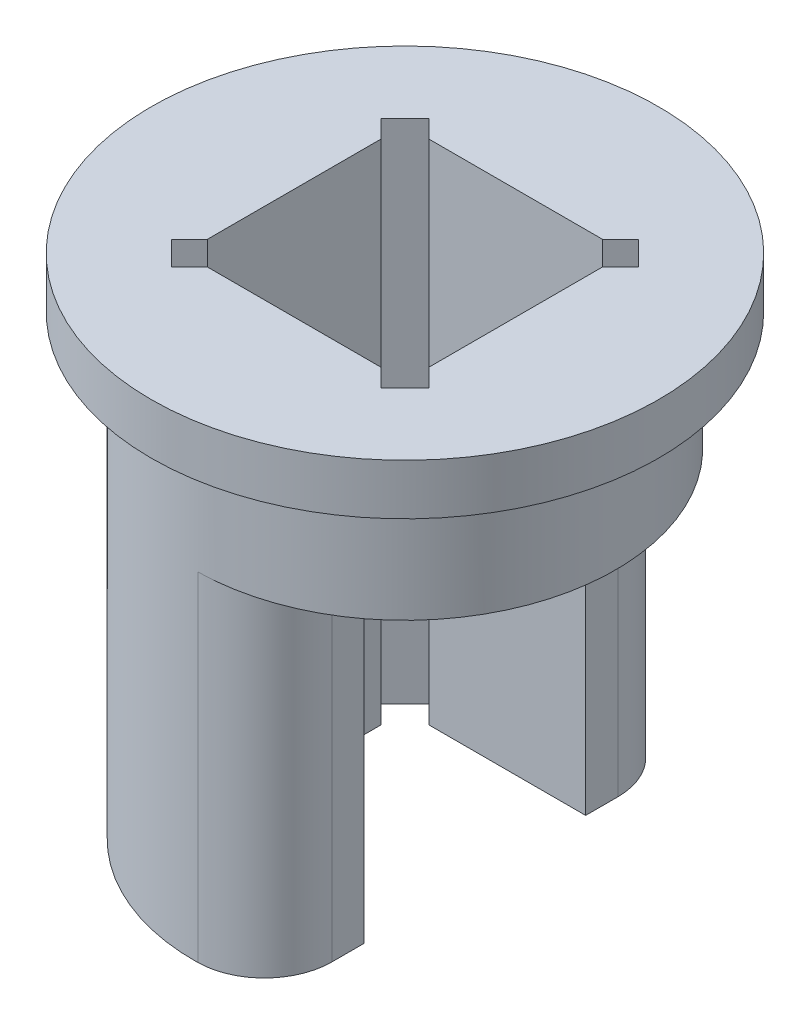
ISO-10303-21;
HEADER;
FILE_DESCRIPTION(('STEP AP214'),'2;1');
FILE_NAME('part.step','',(''),(''),'','','');
FILE_SCHEMA(('AUTOMOTIVE_DESIGN { 1 0 10303 214 1 1 1 1 }'));
ENDSEC;
DATA;
#1=APPLICATION_CONTEXT('core data for automotive mechanical design processes');
#2=APPLICATION_PROTOCOL_DEFINITION('international standard','automotive_design',2000,#1);
#3=PRODUCT_CONTEXT('',#1,'mechanical');
#4=PRODUCT('Part','Part','',(#3));
#5=PRODUCT_RELATED_PRODUCT_CATEGORY('part','',(#4));
#6=PRODUCT_DEFINITION_FORMATION('','',#4);
#7=PRODUCT_DEFINITION_CONTEXT('part definition',#1,'design');
#8=PRODUCT_DEFINITION('design','',#6,#7);
#9=PRODUCT_DEFINITION_SHAPE('','',#8);
#10=(LENGTH_UNIT() NAMED_UNIT(*) SI_UNIT(.MILLI.,.METRE.));
#11=(NAMED_UNIT(*) PLANE_ANGLE_UNIT() SI_UNIT($,.RADIAN.));
#12=(NAMED_UNIT(*) SI_UNIT($,.STERADIAN.) SOLID_ANGLE_UNIT());
#13=UNCERTAINTY_MEASURE_WITH_UNIT(LENGTH_MEASURE(1.E-05),#10,'distance_accuracy_value','');
#14=(GEOMETRIC_REPRESENTATION_CONTEXT(3) GLOBAL_UNCERTAINTY_ASSIGNED_CONTEXT((#13)) GLOBAL_UNIT_ASSIGNED_CONTEXT((#10,
#11,#12)) REPRESENTATION_CONTEXT('',''));
#15=CARTESIAN_POINT('',(0.,0.,0.));
#16=DIRECTION('',(0.,0.,1.));
#17=DIRECTION('',(1.,0.,0.));
#18=AXIS2_PLACEMENT_3D('',#15,#16,#17);
#19=CARTESIAN_POINT('',(-0.707106781186546,30.,-0.707106781186546));
#20=DIRECTION('',(0.707106781186547,0.,0.707106781186547));
#21=DIRECTION('',(0.707106781186548,0.,-0.707106781186548));
#22=AXIS2_PLACEMENT_3D('',#19,#20,#21);
#23=PLANE('',#22);
#24=DIRECTION('',(0.,-1.,0.));
#25=VECTOR('',#24,1.);
#26=CARTESIAN_POINT('',(5.13578643762691,30.,-6.55));
#27=LINE('',#26,#25);
#28=CARTESIAN_POINT('',(5.13578643762691,30.,-6.55));
#29=VERTEX_POINT('',#28);
#30=CARTESIAN_POINT('',(5.13578643762691,20.,-6.55));
#31=VERTEX_POINT('',#30);
#32=EDGE_CURVE('E264',#29,#31,#27,.T.);
#33=ORIENTED_EDGE('',*,*,#32,.T.);
#34=DIRECTION('',(0.707106781186548,0.,-0.707106781186548));
#35=VECTOR('',#34,1.);
#36=CARTESIAN_POINT('',(-0.707106781186546,20.,-0.707106781186546));
#37=LINE('',#36,#35);
#38=CARTESIAN_POINT('',(6.19644660940673,20.,-7.61066017177982));
#39=VERTEX_POINT('',#38);
#40=EDGE_CURVE('E388',#31,#39,#37,.T.);
#41=ORIENTED_EDGE('',*,*,#40,.T.);
#42=DIRECTION('',(0.,-1.,0.));
#43=VECTOR('',#42,1.);
#44=CARTESIAN_POINT('',(6.19644660940673,30.,-7.61066017177982));
#45=LINE('',#44,#43);
#46=CARTESIAN_POINT('',(6.19644660940673,30.,-7.61066017177982));
#47=VERTEX_POINT('',#46);
#48=EDGE_CURVE('E261',#47,#39,#45,.T.);
#49=ORIENTED_EDGE('',*,*,#48,.F.);
#50=DIRECTION('',(-0.707106781186548,0.,0.707106781186548));
#51=VECTOR('',#50,1.);
#52=CARTESIAN_POINT('',(-0.707106781186546,30.,-0.707106781186546));
#53=LINE('',#52,#51);
#54=EDGE_CURVE('E370',#47,#29,#53,.T.);
#55=ORIENTED_EDGE('',*,*,#54,.T.);
#56=EDGE_LOOP('',(#33,#41,#49,#55));
#57=FACE_BOUND('',#56,.T.);
#58=ADVANCED_FACE('F35',(#57),#23,.T.);
#59=CARTESIAN_POINT('',(6.90355339059328,30.,-6.90355339059327));
#60=DIRECTION('',(-0.707106781186548,0.,0.707106781186547));
#61=DIRECTION('',(0.707106781186547,0.,0.707106781186548));
#62=AXIS2_PLACEMENT_3D('',#59,#60,#61);
#63=PLANE('',#62);
#64=ORIENTED_EDGE('',*,*,#48,.T.);
#65=DIRECTION('',(0.707106781186547,0.,0.707106781186548));
#66=VECTOR('',#65,1.);
#67=CARTESIAN_POINT('',(6.90355339059328,20.,-6.90355339059327));
#68=LINE('',#67,#66);
#69=CARTESIAN_POINT('',(7.61066017177982,20.,-6.19644660940673));
#70=VERTEX_POINT('',#69);
#71=EDGE_CURVE('E391',#39,#70,#68,.T.);
#72=ORIENTED_EDGE('',*,*,#71,.T.);
#73=DIRECTION('',(0.,-1.,0.));
#74=VECTOR('',#73,1.);
#75=CARTESIAN_POINT('',(7.61066017177982,30.,-6.19644660940673));
#76=LINE('',#75,#74);
#77=CARTESIAN_POINT('',(7.61066017177982,30.,-6.19644660940673));
#78=VERTEX_POINT('',#77);
#79=EDGE_CURVE('E258',#78,#70,#76,.T.);
#80=ORIENTED_EDGE('',*,*,#79,.F.);
#81=DIRECTION('',(-0.707106781186547,0.,-0.707106781186548));
#82=VECTOR('',#81,1.);
#83=CARTESIAN_POINT('',(6.90355339059328,30.,-6.90355339059327));
#84=LINE('',#83,#82);
#85=EDGE_CURVE('E374',#78,#47,#84,.T.);
#86=ORIENTED_EDGE('',*,*,#85,.T.);
#87=EDGE_LOOP('',(#64,#72,#80,#86));
#88=FACE_BOUND('',#87,.T.);
#89=ADVANCED_FACE('F407',(#88),#63,.T.);
#90=CARTESIAN_POINT('',(0.707106781186546,30.,0.707106781186546));
#91=DIRECTION('',(0.707106781186547,0.,0.707106781186547));
#92=DIRECTION('',(0.707106781186548,0.,-0.707106781186548));
#93=AXIS2_PLACEMENT_3D('',#90,#91,#92);
#94=PLANE('',#93);
#95=DIRECTION('',(0.707106781186548,0.,-0.707106781186548));
#96=VECTOR('',#95,1.);
#97=CARTESIAN_POINT('',(0.707106781186546,20.,0.707106781186546));
#98=LINE('',#97,#96);
#99=CARTESIAN_POINT('',(6.55,20.,-5.13578643762691));
#100=VERTEX_POINT('',#99);
#101=EDGE_CURVE('E394',#100,#70,#98,.T.);
#102=ORIENTED_EDGE('',*,*,#101,.F.);
#103=DIRECTION('',(0.,-1.,0.));
#104=VECTOR('',#103,1.);
#105=CARTESIAN_POINT('',(6.55,30.,-5.13578643762691));
#106=LINE('',#105,#104);
#107=CARTESIAN_POINT('',(6.55,30.,-5.13578643762691));
#108=VERTEX_POINT('',#107);
#109=EDGE_CURVE('E255',#108,#100,#106,.T.);
#110=ORIENTED_EDGE('',*,*,#109,.F.);
#111=DIRECTION('',(-0.707106781186548,0.,0.707106781186548));
#112=VECTOR('',#111,1.);
#113=CARTESIAN_POINT('',(0.707106781186546,30.,0.707106781186546));
#114=LINE('',#113,#112);
#115=EDGE_CURVE('E364',#78,#108,#114,.T.);
#116=ORIENTED_EDGE('',*,*,#115,.F.);
#117=ORIENTED_EDGE('',*,*,#79,.T.);
#118=EDGE_LOOP('',(#102,#110,#116,#117));
#119=FACE_BOUND('',#118,.T.);
#120=ADVANCED_FACE('F418',(#119),#94,.F.);
#121=CARTESIAN_POINT('',(6.55,30.,0.));
#122=DIRECTION('',(-1.,0.,0.));
#123=DIRECTION('',(0.,0.,1.));
#124=AXIS2_PLACEMENT_3D('',#121,#122,#123);
#125=PLANE('',#124);
#126=ORIENTED_EDGE('',*,*,#109,.T.);
#127=DIRECTION('',(0.,0.,1.));
#128=VECTOR('',#127,1.);
#129=CARTESIAN_POINT('',(6.55,20.,0.));
#130=LINE('',#129,#128);
#131=CARTESIAN_POINT('',(6.55,20.,5.13578643762691));
#132=VERTEX_POINT('',#131);
#133=EDGE_CURVE('E396',#100,#132,#130,.T.);
#134=ORIENTED_EDGE('',*,*,#133,.T.);
#135=DIRECTION('',(0.,-1.,0.));
#136=VECTOR('',#135,1.);
#137=CARTESIAN_POINT('',(6.55,30.,5.13578643762691));
#138=LINE('',#137,#136);
#139=CARTESIAN_POINT('',(6.55,30.,5.13578643762691));
#140=VERTEX_POINT('',#139);
#141=EDGE_CURVE('E252',#140,#132,#138,.T.);
#142=ORIENTED_EDGE('',*,*,#141,.F.);
#143=DIRECTION('',(0.,0.,-1.));
#144=VECTOR('',#143,1.);
#145=CARTESIAN_POINT('',(6.55,30.,0.));
#146=LINE('',#145,#144);
#147=EDGE_CURVE('E415',#140,#108,#146,.T.);
#148=ORIENTED_EDGE('',*,*,#147,.T.);
#149=EDGE_LOOP('',(#126,#134,#142,#148));
#150=FACE_BOUND('',#149,.T.);
#151=ADVANCED_FACE('F420',(#150),#125,.T.);
#152=CARTESIAN_POINT('',(0.707106781186546,30.,-0.707106781186546));
#153=DIRECTION('',(0.707106781186547,0.,-0.707106781186547));
#154=DIRECTION('',(-0.707106781186548,0.,-0.707106781186548));
#155=AXIS2_PLACEMENT_3D('',#152,#153,#154);
#156=PLANE('',#155);
#157=DIRECTION('',(-0.707106781186548,0.,-0.707106781186548));
#158=VECTOR('',#157,1.);
#159=CARTESIAN_POINT('',(0.707106781186546,20.,-0.707106781186546));
#160=LINE('',#159,#158);
#161=CARTESIAN_POINT('',(7.61066017177982,20.,6.19644660940673));
#162=VERTEX_POINT('',#161);
#163=EDGE_CURVE('E399',#162,#132,#160,.T.);
#164=ORIENTED_EDGE('',*,*,#163,.F.);
#165=DIRECTION('',(0.,-1.,0.));
#166=VECTOR('',#165,1.);
#167=CARTESIAN_POINT('',(7.61066017177982,30.,6.19644660940673));
#168=LINE('',#167,#166);
#169=CARTESIAN_POINT('',(7.61066017177982,30.,6.19644660940673));
#170=VERTEX_POINT('',#169);
#171=EDGE_CURVE('E249',#170,#162,#168,.T.);
#172=ORIENTED_EDGE('',*,*,#171,.F.);
#173=DIRECTION('',(0.707106781186548,0.,0.707106781186548));
#174=VECTOR('',#173,1.);
#175=CARTESIAN_POINT('',(0.707106781186546,30.,-0.707106781186546));
#176=LINE('',#175,#174);
#177=EDGE_CURVE('E381',#140,#170,#176,.T.);
#178=ORIENTED_EDGE('',*,*,#177,.F.);
#179=ORIENTED_EDGE('',*,*,#141,.T.);
#180=EDGE_LOOP('',(#164,#172,#178,#179));
#181=FACE_BOUND('',#180,.T.);
#182=ADVANCED_FACE('F432',(#181),#156,.F.);
#183=CARTESIAN_POINT('',(6.90355339059328,30.,6.90355339059327));
#184=DIRECTION('',(-0.707106781186548,0.,-0.707106781186547));
#185=DIRECTION('',(-0.707106781186547,0.,0.707106781186548));
#186=AXIS2_PLACEMENT_3D('',#183,#184,#185);
#187=PLANE('',#186);
#188=ORIENTED_EDGE('',*,*,#171,.T.);
#189=DIRECTION('',(-0.707106781186547,0.,0.707106781186548));
#190=VECTOR('',#189,1.);
#191=CARTESIAN_POINT('',(6.90355339059328,20.,6.90355339059327));
#192=LINE('',#191,#190);
#193=CARTESIAN_POINT('',(6.19644660940673,20.,7.61066017177982));
#194=VERTEX_POINT('',#193);
#195=EDGE_CURVE('E401',#162,#194,#192,.T.);
#196=ORIENTED_EDGE('',*,*,#195,.T.);
#197=DIRECTION('',(0.,-1.,0.));
#198=VECTOR('',#197,1.);
#199=CARTESIAN_POINT('',(6.19644660940673,30.,7.61066017177982));
#200=LINE('',#199,#198);
#201=CARTESIAN_POINT('',(6.19644660940673,30.,7.61066017177982));
#202=VERTEX_POINT('',#201);
#203=EDGE_CURVE('E246',#202,#194,#200,.T.);
#204=ORIENTED_EDGE('',*,*,#203,.F.);
#205=DIRECTION('',(0.707106781186547,0.,-0.707106781186548));
#206=VECTOR('',#205,1.);
#207=CARTESIAN_POINT('',(6.90355339059328,30.,6.90355339059327));
#208=LINE('',#207,#206);
#209=EDGE_CURVE('E366',#202,#170,#208,.T.);
#210=ORIENTED_EDGE('',*,*,#209,.T.);
#211=EDGE_LOOP('',(#188,#196,#204,#210));
#212=FACE_BOUND('',#211,.T.);
#213=ADVANCED_FACE('F426',(#212),#187,.T.);
#214=CARTESIAN_POINT('',(-0.707106781186546,30.,0.707106781186546));
#215=DIRECTION('',(0.707106781186547,0.,-0.707106781186547));
#216=DIRECTION('',(-0.707106781186548,0.,-0.707106781186548));
#217=AXIS2_PLACEMENT_3D('',#214,#215,#216);
#218=PLANE('',#217);
#219=ORIENTED_EDGE('',*,*,#203,.T.);
#220=DIRECTION('',(-0.707106781186548,0.,-0.707106781186548));
#221=VECTOR('',#220,1.);
#222=CARTESIAN_POINT('',(-0.707106781186546,20.,0.707106781186546));
#223=LINE('',#222,#221);
#224=CARTESIAN_POINT('',(5.13578643762691,20.,6.55));
#225=VERTEX_POINT('',#224);
#226=EDGE_CURVE('E309',#194,#225,#223,.T.);
#227=ORIENTED_EDGE('',*,*,#226,.T.);
#228=DIRECTION('',(0.,-1.,0.));
#229=VECTOR('',#228,1.);
#230=CARTESIAN_POINT('',(5.13578643762691,30.,6.55));
#231=LINE('',#230,#229);
#232=CARTESIAN_POINT('',(5.13578643762691,30.,6.55));
#233=VERTEX_POINT('',#232);
#234=EDGE_CURVE('E244',#233,#225,#231,.T.);
#235=ORIENTED_EDGE('',*,*,#234,.F.);
#236=DIRECTION('',(0.707106781186548,0.,0.707106781186548));
#237=VECTOR('',#236,1.);
#238=CARTESIAN_POINT('',(-0.707106781186546,30.,0.707106781186546));
#239=LINE('',#238,#237);
#240=EDGE_CURVE('E361',#233,#202,#239,.T.);
#241=ORIENTED_EDGE('',*,*,#240,.T.);
#242=EDGE_LOOP('',(#219,#227,#235,#241));
#243=FACE_BOUND('',#242,.T.);
#244=ADVANCED_FACE('F429',(#243),#218,.T.);
#245=CARTESIAN_POINT('',(0.,30.,0.));
#246=DIRECTION('',(0.,-1.,0.));
#247=DIRECTION('',(0.,0.,-1.));
#248=AXIS2_PLACEMENT_3D('',#245,#246,#247);
#249=CYLINDRICAL_SURFACE('',#248,12.45);
#250=CARTESIAN_POINT('',(0.,0.,0.));
#251=DIRECTION('',(0.,1.,0.));
#252=DIRECTION('',(0.,0.,1.));
#253=AXIS2_PLACEMENT_3D('',#250,#251,#252);
#254=CIRCLE('',#253,12.45);
#255=CARTESIAN_POINT('',(0.200064041237278,0.,-12.4483924415727));
#256=VERTEX_POINT('',#255);
#257=CARTESIAN_POINT('',(0.200064041237278,0.,12.4483924415727));
#258=VERTEX_POINT('',#257);
#259=EDGE_CURVE('E226',#256,#258,#254,.T.);
#260=ORIENTED_EDGE('',*,*,#259,.T.);
#261=DIRECTION('',(0.,-1.,0.));
#262=VECTOR('',#261,1.);
#263=CARTESIAN_POINT('',(0.200064041237278,30.,12.4483924415727));
#264=LINE('',#263,#262);
#265=CARTESIAN_POINT('',(0.200064041237278,20.,12.4483924415727));
#266=VERTEX_POINT('',#265);
#267=EDGE_CURVE('E287',#258,#266,#264,.F.);
#268=ORIENTED_EDGE('',*,*,#267,.T.);
#269=CARTESIAN_POINT('',(0.,20.,0.));
#270=DIRECTION('',(0.,-1.,0.));
#271=DIRECTION('',(0.,0.,-1.));
#272=AXIS2_PLACEMENT_3D('',#269,#270,#271);
#273=CIRCLE('',#272,12.45);
#274=CARTESIAN_POINT('',(0.200064041237278,20.,-12.4483924415727));
#275=VERTEX_POINT('',#274);
#276=EDGE_CURVE('E57',#275,#266,#273,.T.);
#277=ORIENTED_EDGE('',*,*,#276,.F.);
#278=DIRECTION('',(0.,-1.,0.));
#279=VECTOR('',#278,1.);
#280=CARTESIAN_POINT('',(0.200064041237278,30.,-12.4483924415727));
#281=LINE('',#280,#279);
#282=EDGE_CURVE('E284',#275,#256,#281,.T.);
#283=ORIENTED_EDGE('',*,*,#282,.T.);
#284=EDGE_LOOP('',(#260,#268,#277,#283));
#285=FACE_BOUND('',#284,.T.);
#286=CARTESIAN_POINT('',(0.,27.,0.));
#287=DIRECTION('',(0.,1.,0.));
#288=DIRECTION('',(0.,0.,1.));
#289=AXIS2_PLACEMENT_3D('',#286,#287,#288);
#290=CIRCLE('',#289,12.45);
#291=CARTESIAN_POINT('',(0.,27.,12.45));
#292=VERTEX_POINT('',#291);
#293=EDGE_CURVE('E273',#292,#292,#290,.T.);
#294=ORIENTED_EDGE('',*,*,#293,.F.);
#295=EDGE_LOOP('',(#294));
#296=FACE_BOUND('',#295,.T.);
#297=ADVANCED_FACE('F298',(#285,#296),#249,.T.);
#298=CARTESIAN_POINT('',(-6.90355339059327,30.,-6.90355339059328));
#299=DIRECTION('',(-0.707106781186547,0.,-0.707106781186548));
#300=DIRECTION('',(-0.707106781186548,0.,0.707106781186547));
#301=AXIS2_PLACEMENT_3D('',#298,#299,#300);
#302=PLANE('',#301);
#303=DIRECTION('',(0.707106781186548,0.,-0.707106781186547));
#304=VECTOR('',#303,1.);
#305=CARTESIAN_POINT('',(-6.90355339059327,0.,-6.90355339059328));
#306=LINE('',#305,#304);
#307=CARTESIAN_POINT('',(-7.61066017177982,0.,-6.19644660940673));
#308=VERTEX_POINT('',#307);
#309=CARTESIAN_POINT('',(-6.19644660940673,0.,-7.61066017177982));
#310=VERTEX_POINT('',#309);
#311=EDGE_CURVE('E317',#308,#310,#306,.T.);
#312=ORIENTED_EDGE('',*,*,#311,.T.);
#313=DIRECTION('',(0.,-1.,0.));
#314=VECTOR('',#313,1.);
#315=CARTESIAN_POINT('',(-6.19644660940673,30.,-7.61066017177982));
#316=LINE('',#315,#314);
#317=CARTESIAN_POINT('',(-6.19644660940673,30.,-7.61066017177982));
#318=VERTEX_POINT('',#317);
#319=EDGE_CURVE('E270',#318,#310,#316,.T.);
#320=ORIENTED_EDGE('',*,*,#319,.F.);
#321=DIRECTION('',(0.707106781186548,0.,-0.707106781186547));
#322=VECTOR('',#321,1.);
#323=CARTESIAN_POINT('',(-6.90355339059327,30.,-6.90355339059328));
#324=LINE('',#323,#322);
#325=CARTESIAN_POINT('',(-7.61066017177982,30.,-6.19644660940673));
#326=VERTEX_POINT('',#325);
#327=EDGE_CURVE('E229',#326,#318,#324,.T.);
#328=ORIENTED_EDGE('',*,*,#327,.F.);
#329=DIRECTION('',(0.,-1.,0.));
#330=VECTOR('',#329,1.);
#331=CARTESIAN_POINT('',(-7.61066017177982,30.,-6.19644660940673));
#332=LINE('',#331,#330);
#333=EDGE_CURVE('E230',#326,#308,#332,.T.);
#334=ORIENTED_EDGE('',*,*,#333,.T.);
#335=EDGE_LOOP('',(#312,#320,#328,#334));
#336=FACE_BOUND('',#335,.T.);
#337=ADVANCED_FACE('F327',(#336),#302,.F.);
#338=DIRECTION('',(0.707106781186548,0.,0.707106781186548));
#339=VECTOR('',#338,1.);
#340=CARTESIAN_POINT('',(0.707106781186546,0.,-0.707106781186546));
#341=LINE('',#340,#339);
#342=CARTESIAN_POINT('',(-5.13578643762691,0.,-6.55));
#343=VERTEX_POINT('',#342);
#344=EDGE_CURVE('E215',#310,#343,#341,.T.);
#345=ORIENTED_EDGE('',*,*,#344,.T.);
#346=DIRECTION('',(0.,-1.,0.));
#347=VECTOR('',#346,1.);
#348=CARTESIAN_POINT('',(-5.13578643762691,30.,-6.55));
#349=LINE('',#348,#347);
#350=CARTESIAN_POINT('',(-5.13578643762691,30.,-6.55));
#351=VERTEX_POINT('',#350);
#352=EDGE_CURVE('E267',#351,#343,#349,.T.);
#353=ORIENTED_EDGE('',*,*,#352,.F.);
#354=EDGE_CURVE('E323',#318,#351,#176,.T.);
#355=ORIENTED_EDGE('',*,*,#354,.F.);
#356=ORIENTED_EDGE('',*,*,#319,.T.);
#357=EDGE_LOOP('',(#345,#353,#355,#356));
#358=FACE_BOUND('',#357,.T.);
#359=ADVANCED_FACE('F322',(#358),#156,.F.);
#360=CARTESIAN_POINT('',(0.,30.,-6.55));
#361=DIRECTION('',(0.,0.,-1.));
#362=DIRECTION('',(-1.,0.,0.));
#363=AXIS2_PLACEMENT_3D('',#360,#361,#362);
#364=PLANE('',#363);
#365=DIRECTION('',(1.,0.,0.));
#366=VECTOR('',#365,1.);
#367=CARTESIAN_POINT('',(0.,0.,-6.55));
#368=LINE('',#367,#366);
#369=CARTESIAN_POINT('',(4.13578643762691,0.,-6.55));
#370=VERTEX_POINT('',#369);
#371=EDGE_CURVE('E210',#343,#370,#368,.T.);
#372=ORIENTED_EDGE('',*,*,#371,.T.);
#373=DIRECTION('',(0.,1.,0.));
#374=VECTOR('',#373,1.);
#375=CARTESIAN_POINT('',(4.13578643762691,30.,-6.55));
#376=LINE('',#375,#374);
#377=CARTESIAN_POINT('',(4.13578643762691,20.,-6.55));
#378=VERTEX_POINT('',#377);
#379=EDGE_CURVE('E203',#370,#378,#376,.T.);
#380=ORIENTED_EDGE('',*,*,#379,.T.);
#381=DIRECTION('',(-1.,0.,0.));
#382=VECTOR('',#381,1.);
#383=CARTESIAN_POINT('',(0.,20.,-6.55));
#384=LINE('',#383,#382);
#385=EDGE_CURVE('E385',#31,#378,#384,.T.);
#386=ORIENTED_EDGE('',*,*,#385,.F.);
#387=ORIENTED_EDGE('',*,*,#32,.F.);
#388=DIRECTION('',(1.,0.,0.));
#389=VECTOR('',#388,1.);
#390=CARTESIAN_POINT('',(0.,30.,-6.55));
#391=LINE('',#390,#389);
#392=EDGE_CURVE('E375',#351,#29,#391,.T.);
#393=ORIENTED_EDGE('',*,*,#392,.F.);
#394=ORIENTED_EDGE('',*,*,#352,.T.);
#395=EDGE_LOOP('',(#372,#380,#386,#387,#393,#394));
#396=FACE_BOUND('',#395,.T.);
#397=ADVANCED_FACE('F311',(#396),#364,.F.);
#398=CARTESIAN_POINT('',(0.,30.,6.55));
#399=DIRECTION('',(0.,0.,-1.));
#400=DIRECTION('',(-1.,0.,0.));
#401=AXIS2_PLACEMENT_3D('',#398,#399,#400);
#402=PLANE('',#401);
#403=DIRECTION('',(0.,1.,0.));
#404=VECTOR('',#403,1.);
#405=CARTESIAN_POINT('',(4.13578643762691,30.,6.55));
#406=LINE('',#405,#404);
#407=CARTESIAN_POINT('',(4.13578643762691,0.,6.55));
#408=VERTEX_POINT('',#407);
#409=CARTESIAN_POINT('',(4.13578643762691,20.,6.55));
#410=VERTEX_POINT('',#409);
#411=EDGE_CURVE('E190',#408,#410,#406,.T.);
#412=ORIENTED_EDGE('',*,*,#411,.F.);
#413=DIRECTION('',(1.,0.,0.));
#414=VECTOR('',#413,1.);
#415=CARTESIAN_POINT('',(0.,0.,6.55));
#416=LINE('',#415,#414);
#417=CARTESIAN_POINT('',(-5.13578643762691,0.,6.55));
#418=VERTEX_POINT('',#417);
#419=EDGE_CURVE('E200',#418,#408,#416,.T.);
#420=ORIENTED_EDGE('',*,*,#419,.F.);
#421=DIRECTION('',(0.,-1.,0.));
#422=VECTOR('',#421,1.);
#423=CARTESIAN_POINT('',(-5.13578643762691,30.,6.55));
#424=LINE('',#423,#422);
#425=CARTESIAN_POINT('',(-5.13578643762691,30.,6.55));
#426=VERTEX_POINT('',#425);
#427=EDGE_CURVE('E242',#426,#418,#424,.T.);
#428=ORIENTED_EDGE('',*,*,#427,.F.);
#429=DIRECTION('',(1.,0.,0.));
#430=VECTOR('',#429,1.);
#431=CARTESIAN_POINT('',(0.,30.,6.55));
#432=LINE('',#431,#430);
#433=EDGE_CURVE('E358',#426,#233,#432,.T.);
#434=ORIENTED_EDGE('',*,*,#433,.T.);
#435=ORIENTED_EDGE('',*,*,#234,.T.);
#436=DIRECTION('',(-1.,0.,0.));
#437=VECTOR('',#436,1.);
#438=CARTESIAN_POINT('',(0.,20.,6.55));
#439=LINE('',#438,#437);
#440=EDGE_CURVE('E202',#225,#410,#439,.T.);
#441=ORIENTED_EDGE('',*,*,#440,.T.);
#442=EDGE_LOOP('',(#412,#420,#428,#434,#435,#441));
#443=FACE_BOUND('',#442,.T.);
#444=ADVANCED_FACE('F199',(#443),#402,.T.);
#445=DIRECTION('',(-0.707106781186548,0.,0.707106781186548));
#446=VECTOR('',#445,1.);
#447=CARTESIAN_POINT('',(0.707106781186546,0.,0.707106781186546));
#448=LINE('',#447,#446);
#449=CARTESIAN_POINT('',(-6.19644660940673,0.,7.61066017177982));
#450=VERTEX_POINT('',#449);
#451=EDGE_CURVE('E209',#418,#450,#448,.T.);
#452=ORIENTED_EDGE('',*,*,#451,.T.);
#453=DIRECTION('',(0.,-1.,0.));
#454=VECTOR('',#453,1.);
#455=CARTESIAN_POINT('',(-6.19644660940673,30.,7.61066017177982));
#456=LINE('',#455,#454);
#457=CARTESIAN_POINT('',(-6.19644660940673,30.,7.61066017177982));
#458=VERTEX_POINT('',#457);
#459=EDGE_CURVE('E239',#458,#450,#456,.T.);
#460=ORIENTED_EDGE('',*,*,#459,.F.);
#461=EDGE_CURVE('E355',#426,#458,#114,.T.);
#462=ORIENTED_EDGE('',*,*,#461,.F.);
#463=ORIENTED_EDGE('',*,*,#427,.T.);
#464=EDGE_LOOP('',(#452,#460,#462,#463));
#465=FACE_BOUND('',#464,.T.);
#466=ADVANCED_FACE('F354',(#465),#94,.F.);
#467=CARTESIAN_POINT('',(-6.90355339059327,30.,6.90355339059327));
#468=DIRECTION('',(-0.707106781186547,0.,0.707106781186548));
#469=DIRECTION('',(0.707106781186548,0.,0.707106781186547));
#470=AXIS2_PLACEMENT_3D('',#467,#468,#469);
#471=PLANE('',#470);
#472=DIRECTION('',(-0.707106781186548,0.,-0.707106781186547));
#473=VECTOR('',#472,1.);
#474=CARTESIAN_POINT('',(-6.90355339059327,0.,6.90355339059327));
#475=LINE('',#474,#473);
#476=CARTESIAN_POINT('',(-7.61066017177982,0.,6.19644660940673));
#477=VERTEX_POINT('',#476);
#478=EDGE_CURVE('E212',#450,#477,#475,.T.);
#479=ORIENTED_EDGE('',*,*,#478,.T.);
#480=DIRECTION('',(0.,-1.,0.));
#481=VECTOR('',#480,1.);
#482=CARTESIAN_POINT('',(-7.61066017177982,30.,6.19644660940673));
#483=LINE('',#482,#481);
#484=CARTESIAN_POINT('',(-7.61066017177982,30.,6.19644660940673));
#485=VERTEX_POINT('',#484);
#486=EDGE_CURVE('E237',#485,#477,#483,.T.);
#487=ORIENTED_EDGE('',*,*,#486,.F.);
#488=DIRECTION('',(-0.707106781186548,0.,-0.707106781186547));
#489=VECTOR('',#488,1.);
#490=CARTESIAN_POINT('',(-6.90355339059327,30.,6.90355339059327));
#491=LINE('',#490,#489);
#492=EDGE_CURVE('E351',#458,#485,#491,.T.);
#493=ORIENTED_EDGE('',*,*,#492,.F.);
#494=ORIENTED_EDGE('',*,*,#459,.T.);
#495=EDGE_LOOP('',(#479,#487,#493,#494));
#496=FACE_BOUND('',#495,.T.);
#497=ADVANCED_FACE('F349',(#496),#471,.F.);
#498=DIRECTION('',(-0.707106781186548,0.,0.707106781186548));
#499=VECTOR('',#498,1.);
#500=CARTESIAN_POINT('',(-0.707106781186546,0.,-0.707106781186546));
#501=LINE('',#500,#499);
#502=CARTESIAN_POINT('',(-6.55,0.,5.13578643762691));
#503=VERTEX_POINT('',#502);
#504=EDGE_CURVE('E222',#503,#477,#501,.T.);
#505=ORIENTED_EDGE('',*,*,#504,.F.);
#506=DIRECTION('',(0.,-1.,0.));
#507=VECTOR('',#506,1.);
#508=CARTESIAN_POINT('',(-6.55,30.,5.13578643762691));
#509=LINE('',#508,#507);
#510=CARTESIAN_POINT('',(-6.55,30.,5.13578643762691));
#511=VERTEX_POINT('',#510);
#512=EDGE_CURVE('E235',#511,#503,#509,.T.);
#513=ORIENTED_EDGE('',*,*,#512,.F.);
#514=EDGE_CURVE('E346',#511,#485,#53,.T.);
#515=ORIENTED_EDGE('',*,*,#514,.T.);
#516=ORIENTED_EDGE('',*,*,#486,.T.);
#517=EDGE_LOOP('',(#505,#513,#515,#516));
#518=FACE_BOUND('',#517,.T.);
#519=ADVANCED_FACE('F341',(#518),#23,.T.);
#520=CARTESIAN_POINT('',(-6.55,30.,0.));
#521=DIRECTION('',(-1.,0.,0.));
#522=DIRECTION('',(0.,0.,1.));
#523=AXIS2_PLACEMENT_3D('',#520,#521,#522);
#524=PLANE('',#523);
#525=DIRECTION('',(0.,0.,-1.));
#526=VECTOR('',#525,1.);
#527=CARTESIAN_POINT('',(-6.55,0.,0.));
#528=LINE('',#527,#526);
#529=CARTESIAN_POINT('',(-6.55,0.,-5.13578643762691));
#530=VERTEX_POINT('',#529);
#531=EDGE_CURVE('E223',#503,#530,#528,.T.);
#532=ORIENTED_EDGE('',*,*,#531,.T.);
#533=DIRECTION('',(0.,-1.,0.));
#534=VECTOR('',#533,1.);
#535=CARTESIAN_POINT('',(-6.55,30.,-5.13578643762691));
#536=LINE('',#535,#534);
#537=CARTESIAN_POINT('',(-6.55,30.,-5.13578643762691));
#538=VERTEX_POINT('',#537);
#539=EDGE_CURVE('E232',#538,#530,#536,.T.);
#540=ORIENTED_EDGE('',*,*,#539,.F.);
#541=DIRECTION('',(0.,0.,-1.));
#542=VECTOR('',#541,1.);
#543=CARTESIAN_POINT('',(-6.55,30.,0.));
#544=LINE('',#543,#542);
#545=EDGE_CURVE('E334',#511,#538,#544,.T.);
#546=ORIENTED_EDGE('',*,*,#545,.F.);
#547=ORIENTED_EDGE('',*,*,#512,.T.);
#548=EDGE_LOOP('',(#532,#540,#546,#547));
#549=FACE_BOUND('',#548,.T.);
#550=ADVANCED_FACE('F451',(#549),#524,.F.);
#551=DIRECTION('',(0.707106781186548,0.,0.707106781186548));
#552=VECTOR('',#551,1.);
#553=CARTESIAN_POINT('',(-0.707106781186546,0.,0.707106781186546));
#554=LINE('',#553,#552);
#555=EDGE_CURVE('E219',#308,#530,#554,.T.);
#556=ORIENTED_EDGE('',*,*,#555,.F.);
#557=ORIENTED_EDGE('',*,*,#333,.F.);
#558=EDGE_CURVE('E233',#326,#538,#239,.T.);
#559=ORIENTED_EDGE('',*,*,#558,.T.);
#560=ORIENTED_EDGE('',*,*,#539,.T.);
#561=EDGE_LOOP('',(#556,#557,#559,#560));
#562=FACE_BOUND('',#561,.T.);
#563=ADVANCED_FACE('F456',(#562),#218,.T.);
#564=CARTESIAN_POINT('',(0.,30.,0.));
#565=DIRECTION('',(0.,1.,0.));
#566=DIRECTION('',(0.,0.,1.));
#567=AXIS2_PLACEMENT_3D('',#564,#565,#566);
#568=PLANE('',#567);
#569=ORIENTED_EDGE('',*,*,#327,.T.);
#570=ORIENTED_EDGE('',*,*,#354,.T.);
#571=ORIENTED_EDGE('',*,*,#392,.T.);
#572=ORIENTED_EDGE('',*,*,#54,.F.);
#573=ORIENTED_EDGE('',*,*,#85,.F.);
#574=ORIENTED_EDGE('',*,*,#115,.T.);
#575=ORIENTED_EDGE('',*,*,#147,.F.);
#576=ORIENTED_EDGE('',*,*,#177,.T.);
#577=ORIENTED_EDGE('',*,*,#209,.F.);
#578=ORIENTED_EDGE('',*,*,#240,.F.);
#579=ORIENTED_EDGE('',*,*,#433,.F.);
#580=ORIENTED_EDGE('',*,*,#461,.T.);
#581=ORIENTED_EDGE('',*,*,#492,.T.);
#582=ORIENTED_EDGE('',*,*,#514,.F.);
#583=ORIENTED_EDGE('',*,*,#545,.T.);
#584=ORIENTED_EDGE('',*,*,#558,.F.);
#585=EDGE_LOOP('',(#569,#570,#571,#572,#573,#574,#575,#576,#577,#578,#579,#580,#581,#582,#583,#584));
#586=FACE_BOUND('',#585,.T.);
#587=CARTESIAN_POINT('',(0.,30.,0.));
#588=DIRECTION('',(0.,1.,0.));
#589=DIRECTION('',(0.,0.,1.));
#590=AXIS2_PLACEMENT_3D('',#587,#588,#589);
#591=CIRCLE('',#590,15.);
#592=CARTESIAN_POINT('',(0.,30.,15.));
#593=VERTEX_POINT('',#592);
#594=EDGE_CURVE('E331',#593,#593,#591,.T.);
#595=ORIENTED_EDGE('',*,*,#594,.T.);
#596=EDGE_LOOP('',(#595));
#597=FACE_BOUND('',#596,.T.);
#598=ADVANCED_FACE('F410',(#586,#597),#568,.T.);
#599=CARTESIAN_POINT('',(0.,0.,0.));
#600=DIRECTION('',(0.,1.,0.));
#601=DIRECTION('',(0.,0.,1.));
#602=AXIS2_PLACEMENT_3D('',#599,#600,#601);
#603=PLANE('',#602);
#604=DIRECTION('',(0.,0.,-1.));
#605=VECTOR('',#604,1.);
#606=CARTESIAN_POINT('',(4.13578643762691,0.,-11.7429881436686));
#607=LINE('',#606,#605);
#608=CARTESIAN_POINT('',(4.13578643762691,0.,8.44890892620796));
#609=VERTEX_POINT('',#608);
#610=EDGE_CURVE('E186',#609,#408,#607,.T.);
#611=ORIENTED_EDGE('',*,*,#610,.F.);
#612=CARTESIAN_POINT('',(0.135786437626908,0.,8.44890892620796));
#613=DIRECTION('',(0.,1.,0.));
#614=DIRECTION('',(0.,0.,1.));
#615=AXIS2_PLACEMENT_3D('',#612,#613,#614);
#616=CIRCLE('',#615,4.);
#617=EDGE_CURVE('E282',#609,#258,#616,.F.);
#618=ORIENTED_EDGE('',*,*,#617,.T.);
#619=ORIENTED_EDGE('',*,*,#259,.F.);
#620=CARTESIAN_POINT('',(0.135786437626908,0.,-8.44890892620796));
#621=DIRECTION('',(0.,1.,0.));
#622=DIRECTION('',(0.,0.,1.));
#623=AXIS2_PLACEMENT_3D('',#620,#621,#622);
#624=CIRCLE('',#623,4.);
#625=CARTESIAN_POINT('',(4.13578643762691,0.,-8.44890892620796));
#626=VERTEX_POINT('',#625);
#627=EDGE_CURVE('E280',#256,#626,#624,.F.);
#628=ORIENTED_EDGE('',*,*,#627,.T.);
#629=DIRECTION('',(0.,0.,1.));
#630=VECTOR('',#629,1.);
#631=CARTESIAN_POINT('',(4.13578643762691,0.,0.));
#632=LINE('',#631,#630);
#633=EDGE_CURVE('E276',#626,#370,#632,.T.);
#634=ORIENTED_EDGE('',*,*,#633,.T.);
#635=ORIENTED_EDGE('',*,*,#371,.F.);
#636=ORIENTED_EDGE('',*,*,#344,.F.);
#637=ORIENTED_EDGE('',*,*,#311,.F.);
#638=ORIENTED_EDGE('',*,*,#555,.T.);
#639=ORIENTED_EDGE('',*,*,#531,.F.);
#640=ORIENTED_EDGE('',*,*,#504,.T.);
#641=ORIENTED_EDGE('',*,*,#478,.F.);
#642=ORIENTED_EDGE('',*,*,#451,.F.);
#643=ORIENTED_EDGE('',*,*,#419,.T.);
#644=EDGE_LOOP('',(#611,#618,#619,#628,#634,#635,#636,#637,#638,#639,#640,#641,#642,#643));
#645=FACE_BOUND('',#644,.T.);
#646=ADVANCED_FACE('F207',(#645),#603,.F.);
#647=CARTESIAN_POINT('',(0.,27.,0.));
#648=DIRECTION('',(0.,1.,0.));
#649=DIRECTION('',(0.,0.,1.));
#650=AXIS2_PLACEMENT_3D('',#647,#648,#649);
#651=CYLINDRICAL_SURFACE('',#650,15.);
#652=CARTESIAN_POINT('',(0.,27.,0.));
#653=DIRECTION('',(0.,1.,0.));
#654=DIRECTION('',(0.,0.,1.));
#655=AXIS2_PLACEMENT_3D('',#652,#653,#654);
#656=CIRCLE('',#655,15.);
#657=CARTESIAN_POINT('',(0.,27.,15.));
#658=VERTEX_POINT('',#657);
#659=EDGE_CURVE('E328',#658,#658,#656,.T.);
#660=ORIENTED_EDGE('',*,*,#659,.T.);
#661=EDGE_LOOP('',(#660));
#662=FACE_BOUND('',#661,.T.);
#663=ORIENTED_EDGE('',*,*,#594,.F.);
#664=EDGE_LOOP('',(#663));
#665=FACE_BOUND('',#664,.T.);
#666=ADVANCED_FACE('F486',(#662,#665),#651,.T.);
#667=CARTESIAN_POINT('',(0.,27.,0.));
#668=DIRECTION('',(0.,1.,0.));
#669=DIRECTION('',(0.,0.,1.));
#670=AXIS2_PLACEMENT_3D('',#667,#668,#669);
#671=PLANE('',#670);
#672=ORIENTED_EDGE('',*,*,#293,.T.);
#673=EDGE_LOOP('',(#672));
#674=FACE_BOUND('',#673,.T.);
#675=ORIENTED_EDGE('',*,*,#659,.F.);
#676=EDGE_LOOP('',(#675));
#677=FACE_BOUND('',#676,.T.);
#678=ADVANCED_FACE('F483',(#674,#677),#671,.F.);
#679=CARTESIAN_POINT('',(0.,20.,0.));
#680=DIRECTION('',(0.,-1.,0.));
#681=DIRECTION('',(0.,0.,-1.));
#682=AXIS2_PLACEMENT_3D('',#679,#680,#681);
#683=PLANE('',#682);
#684=ORIENTED_EDGE('',*,*,#385,.T.);
#685=DIRECTION('',(0.,0.,-1.));
#686=VECTOR('',#685,1.);
#687=CARTESIAN_POINT('',(4.13578643762691,20.,-11.7429881436686));
#688=LINE('',#687,#686);
#689=CARTESIAN_POINT('',(4.13578643762691,20.,-8.44890892620796));
#690=VERTEX_POINT('',#689);
#691=EDGE_CURVE('E293',#378,#690,#688,.T.);
#692=ORIENTED_EDGE('',*,*,#691,.T.);
#693=CARTESIAN_POINT('',(0.135786437626908,20.,-8.44890892620796));
#694=DIRECTION('',(0.,-1.,0.));
#695=DIRECTION('',(0.,0.,-1.));
#696=AXIS2_PLACEMENT_3D('',#693,#694,#695);
#697=CIRCLE('',#696,4.);
#698=EDGE_CURVE('E11',#690,#275,#697,.F.);
#699=ORIENTED_EDGE('',*,*,#698,.T.);
#700=ORIENTED_EDGE('',*,*,#276,.T.);
#701=CARTESIAN_POINT('',(0.135786437626908,20.,8.44890892620796));
#702=DIRECTION('',(0.,-1.,0.));
#703=DIRECTION('',(0.,0.,-1.));
#704=AXIS2_PLACEMENT_3D('',#701,#702,#703);
#705=CIRCLE('',#704,4.);
#706=CARTESIAN_POINT('',(4.13578643762691,20.,8.44890892620796));
#707=VERTEX_POINT('',#706);
#708=EDGE_CURVE('E43',#266,#707,#705,.F.);
#709=ORIENTED_EDGE('',*,*,#708,.T.);
#710=EDGE_CURVE('E204',#707,#410,#688,.T.);
#711=ORIENTED_EDGE('',*,*,#710,.T.);
#712=ORIENTED_EDGE('',*,*,#440,.F.);
#713=ORIENTED_EDGE('',*,*,#226,.F.);
#714=ORIENTED_EDGE('',*,*,#195,.F.);
#715=ORIENTED_EDGE('',*,*,#163,.T.);
#716=ORIENTED_EDGE('',*,*,#133,.F.);
#717=ORIENTED_EDGE('',*,*,#101,.T.);
#718=ORIENTED_EDGE('',*,*,#71,.F.);
#719=ORIENTED_EDGE('',*,*,#40,.F.);
#720=EDGE_LOOP('',(#684,#692,#699,#700,#709,#711,#712,#713,#714,#715,#716,#717,#718,#719));
#721=FACE_BOUND('',#720,.T.);
#722=ADVANCED_FACE('F290',(#721),#683,.T.);
#723=CARTESIAN_POINT('',(4.13578643762691,20.,-11.7429881436686));
#724=DIRECTION('',(-1.,0.,0.));
#725=DIRECTION('',(0.,0.,1.));
#726=AXIS2_PLACEMENT_3D('',#723,#724,#725);
#727=PLANE('',#726);
#728=ORIENTED_EDGE('',*,*,#633,.F.);
#729=DIRECTION('',(0.,-1.,0.));
#730=VECTOR('',#729,1.);
#731=CARTESIAN_POINT('',(4.13578643762691,20.,-8.44890892620796));
#732=LINE('',#731,#730);
#733=EDGE_CURVE('E50',#626,#690,#732,.F.);
#734=ORIENTED_EDGE('',*,*,#733,.T.);
#735=ORIENTED_EDGE('',*,*,#691,.F.);
#736=ORIENTED_EDGE('',*,*,#379,.F.);
#737=EDGE_LOOP('',(#728,#734,#735,#736));
#738=FACE_BOUND('',#737,.T.);
#739=ADVANCED_FACE('F305',(#738),#727,.F.);
#740=ORIENTED_EDGE('',*,*,#710,.F.);
#741=DIRECTION('',(0.,-1.,0.));
#742=VECTOR('',#741,1.);
#743=CARTESIAN_POINT('',(4.13578643762691,20.,8.44890892620796));
#744=LINE('',#743,#742);
#745=EDGE_CURVE('E193',#707,#609,#744,.T.);
#746=ORIENTED_EDGE('',*,*,#745,.T.);
#747=ORIENTED_EDGE('',*,*,#610,.T.);
#748=ORIENTED_EDGE('',*,*,#411,.T.);
#749=EDGE_LOOP('',(#740,#746,#747,#748));
#750=FACE_BOUND('',#749,.T.);
#751=ADVANCED_FACE('F189',(#750),#727,.F.);
#752=CARTESIAN_POINT('',(0.135786437626908,30.,8.44890892620796));
#753=DIRECTION('',(0.,-1.,0.));
#754=DIRECTION('',(0.,0.,-1.));
#755=AXIS2_PLACEMENT_3D('',#752,#753,#754);
#756=CYLINDRICAL_SURFACE('',#755,4.);
#757=ORIENTED_EDGE('',*,*,#708,.F.);
#758=ORIENTED_EDGE('',*,*,#267,.F.);
#759=ORIENTED_EDGE('',*,*,#617,.F.);
#760=ORIENTED_EDGE('',*,*,#745,.F.);
#761=EDGE_LOOP('',(#757,#758,#759,#760));
#762=FACE_BOUND('',#761,.T.);
#763=ADVANCED_FACE('F295',(#762),#756,.T.);
#764=CARTESIAN_POINT('',(0.135786437626908,30.,-8.44890892620796));
#765=DIRECTION('',(0.,-1.,0.));
#766=DIRECTION('',(0.,0.,-1.));
#767=AXIS2_PLACEMENT_3D('',#764,#765,#766);
#768=CYLINDRICAL_SURFACE('',#767,4.);
#769=ORIENTED_EDGE('',*,*,#698,.F.);
#770=ORIENTED_EDGE('',*,*,#733,.F.);
#771=ORIENTED_EDGE('',*,*,#627,.F.);
#772=ORIENTED_EDGE('',*,*,#282,.F.);
#773=EDGE_LOOP('',(#769,#770,#771,#772));
#774=FACE_BOUND('',#773,.T.);
#775=ADVANCED_FACE('F37',(#774),#768,.T.);
#776=CLOSED_SHELL('',(#58,#89,#120,#151,#182,#213,#244,#297,#337,#359,#397,#444,#466,#497,#519,
#550,#563,#598,#646,#666,#678,#722,#739,#751,#763,#775));
#777=MANIFOLD_SOLID_BREP('B2',#776);
#778=ADVANCED_BREP_SHAPE_REPRESENTATION('',(#18,#777),#14);
#779=SHAPE_DEFINITION_REPRESENTATION(#9,#778);
ENDSEC;
END-ISO-10303-21;
